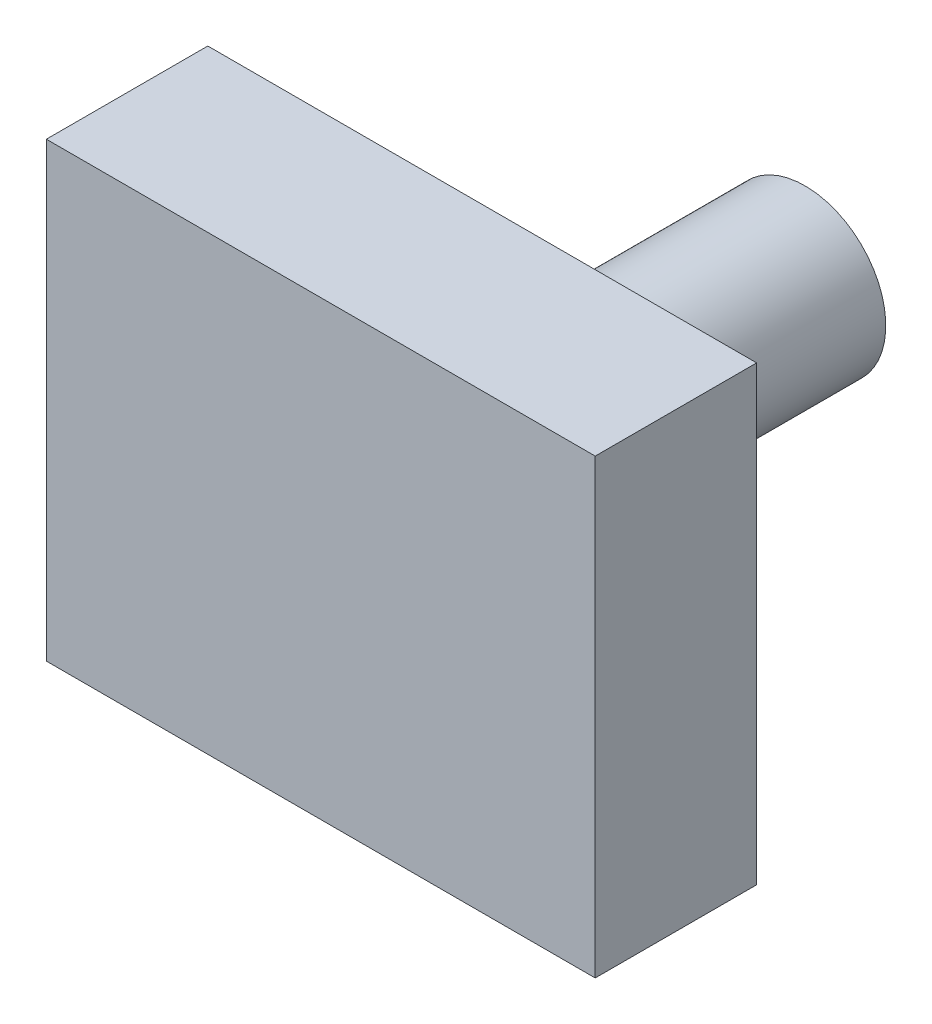
ISO-10303-21;
HEADER;
FILE_DESCRIPTION(('STEP AP214'),'2;1');
FILE_NAME('part.step','',(''),(''),'','','');
FILE_SCHEMA(('AUTOMOTIVE_DESIGN { 1 0 10303 214 1 1 1 1 }'));
ENDSEC;
DATA;
#1=APPLICATION_CONTEXT('core data for automotive mechanical design processes');
#2=APPLICATION_PROTOCOL_DEFINITION('international standard','automotive_design',2000,#1);
#3=PRODUCT_CONTEXT('',#1,'mechanical');
#4=PRODUCT('Part','Part','',(#3));
#5=PRODUCT_RELATED_PRODUCT_CATEGORY('part','',(#4));
#6=PRODUCT_DEFINITION_FORMATION('','',#4);
#7=PRODUCT_DEFINITION_CONTEXT('part definition',#1,'design');
#8=PRODUCT_DEFINITION('design','',#6,#7);
#9=PRODUCT_DEFINITION_SHAPE('','',#8);
#10=(LENGTH_UNIT() NAMED_UNIT(*) SI_UNIT(.MILLI.,.METRE.));
#11=(NAMED_UNIT(*) PLANE_ANGLE_UNIT() SI_UNIT($,.RADIAN.));
#12=(NAMED_UNIT(*) SI_UNIT($,.STERADIAN.) SOLID_ANGLE_UNIT());
#13=UNCERTAINTY_MEASURE_WITH_UNIT(LENGTH_MEASURE(1.E-05),#10,'distance_accuracy_value','');
#14=(GEOMETRIC_REPRESENTATION_CONTEXT(3) GLOBAL_UNCERTAINTY_ASSIGNED_CONTEXT((#13)) GLOBAL_UNIT_ASSIGNED_CONTEXT((#10,
#11,#12)) REPRESENTATION_CONTEXT('',''));
#15=CARTESIAN_POINT('',(0.,0.,0.));
#16=DIRECTION('',(0.,0.,1.));
#17=DIRECTION('',(1.,0.,0.));
#18=AXIS2_PLACEMENT_3D('',#15,#16,#17);
#19=CARTESIAN_POINT('',(8.5,7.,5.));
#20=DIRECTION('',(-1.,0.,0.));
#21=DIRECTION('',(0.,-1.,0.));
#22=AXIS2_PLACEMENT_3D('',#19,#20,#21);
#23=PLANE('',#22);
#24=DIRECTION('',(0.,1.,0.));
#25=VECTOR('',#24,1.);
#26=CARTESIAN_POINT('',(8.5,7.,0.));
#27=LINE('',#26,#25);
#28=CARTESIAN_POINT('',(8.5,-7.,0.));
#29=VERTEX_POINT('',#28);
#30=CARTESIAN_POINT('',(8.5,7.,0.));
#31=VERTEX_POINT('',#30);
#32=EDGE_CURVE('E100',#29,#31,#27,.T.);
#33=ORIENTED_EDGE('',*,*,#32,.T.);
#34=DIRECTION('',(0.,0.,-1.));
#35=VECTOR('',#34,1.);
#36=CARTESIAN_POINT('',(8.5,7.,5.));
#37=LINE('',#36,#35);
#38=CARTESIAN_POINT('',(8.5,7.,5.));
#39=VERTEX_POINT('',#38);
#40=EDGE_CURVE('E37',#39,#31,#37,.T.);
#41=ORIENTED_EDGE('',*,*,#40,.F.);
#42=DIRECTION('',(0.,1.,0.));
#43=VECTOR('',#42,1.);
#44=CARTESIAN_POINT('',(8.5,7.,5.));
#45=LINE('',#44,#43);
#46=CARTESIAN_POINT('',(8.5,-7.,5.));
#47=VERTEX_POINT('',#46);
#48=EDGE_CURVE('E87',#47,#39,#45,.T.);
#49=ORIENTED_EDGE('',*,*,#48,.F.);
#50=DIRECTION('',(0.,0.,-1.));
#51=VECTOR('',#50,1.);
#52=CARTESIAN_POINT('',(8.5,-7.,5.));
#53=LINE('',#52,#51);
#54=EDGE_CURVE('E96',#47,#29,#53,.T.);
#55=ORIENTED_EDGE('',*,*,#54,.T.);
#56=EDGE_LOOP('',(#33,#41,#49,#55));
#57=FACE_BOUND('',#56,.T.);
#58=ADVANCED_FACE('F34',(#57),#23,.F.);
#59=CARTESIAN_POINT('',(-8.5,7.,5.));
#60=DIRECTION('',(0.,-1.,0.));
#61=DIRECTION('',(0.,0.,-1.));
#62=AXIS2_PLACEMENT_3D('',#59,#60,#61);
#63=PLANE('',#62);
#64=DIRECTION('',(-1.,0.,0.));
#65=VECTOR('',#64,1.);
#66=CARTESIAN_POINT('',(-8.5,7.,0.));
#67=LINE('',#66,#65);
#68=CARTESIAN_POINT('',(-8.5,7.,0.));
#69=VERTEX_POINT('',#68);
#70=EDGE_CURVE('E92',#31,#69,#67,.T.);
#71=ORIENTED_EDGE('',*,*,#70,.T.);
#72=DIRECTION('',(0.,0.,-1.));
#73=VECTOR('',#72,1.);
#74=CARTESIAN_POINT('',(-8.5,7.,5.));
#75=LINE('',#74,#73);
#76=CARTESIAN_POINT('',(-8.5,7.,5.));
#77=VERTEX_POINT('',#76);
#78=EDGE_CURVE('E90',#77,#69,#75,.T.);
#79=ORIENTED_EDGE('',*,*,#78,.F.);
#80=DIRECTION('',(-1.,0.,0.));
#81=VECTOR('',#80,1.);
#82=CARTESIAN_POINT('',(-8.5,7.,5.));
#83=LINE('',#82,#81);
#84=EDGE_CURVE('E82',#39,#77,#83,.T.);
#85=ORIENTED_EDGE('',*,*,#84,.F.);
#86=ORIENTED_EDGE('',*,*,#40,.T.);
#87=EDGE_LOOP('',(#71,#79,#85,#86));
#88=FACE_BOUND('',#87,.T.);
#89=ADVANCED_FACE('F91',(#88),#63,.F.);
#90=CARTESIAN_POINT('',(-8.5,7.,5.));
#91=DIRECTION('',(1.,0.,0.));
#92=DIRECTION('',(0.,1.,0.));
#93=AXIS2_PLACEMENT_3D('',#90,#91,#92);
#94=PLANE('',#93);
#95=DIRECTION('',(0.,-1.,0.));
#96=VECTOR('',#95,1.);
#97=CARTESIAN_POINT('',(-8.5,7.,0.));
#98=LINE('',#97,#96);
#99=CARTESIAN_POINT('',(-8.49999999999999,-7.,0.));
#100=VERTEX_POINT('',#99);
#101=EDGE_CURVE('E68',#69,#100,#98,.T.);
#102=ORIENTED_EDGE('',*,*,#101,.T.);
#103=DIRECTION('',(0.,0.,-1.));
#104=VECTOR('',#103,1.);
#105=CARTESIAN_POINT('',(-8.49999999999999,-7.,5.));
#106=LINE('',#105,#104);
#107=CARTESIAN_POINT('',(-8.49999999999999,-7.,5.));
#108=VERTEX_POINT('',#107);
#109=EDGE_CURVE('E93',#108,#100,#106,.T.);
#110=ORIENTED_EDGE('',*,*,#109,.F.);
#111=DIRECTION('',(0.,-1.,0.));
#112=VECTOR('',#111,1.);
#113=CARTESIAN_POINT('',(-8.5,7.,5.));
#114=LINE('',#113,#112);
#115=EDGE_CURVE('E85',#77,#108,#114,.T.);
#116=ORIENTED_EDGE('',*,*,#115,.F.);
#117=ORIENTED_EDGE('',*,*,#78,.T.);
#118=EDGE_LOOP('',(#102,#110,#116,#117));
#119=FACE_BOUND('',#118,.T.);
#120=ADVANCED_FACE('F94',(#119),#94,.F.);
#121=CARTESIAN_POINT('',(-8.49999999999999,-7.,5.));
#122=DIRECTION('',(0.,1.,0.));
#123=DIRECTION('',(0.,0.,1.));
#124=AXIS2_PLACEMENT_3D('',#121,#122,#123);
#125=PLANE('',#124);
#126=DIRECTION('',(1.,0.,0.));
#127=VECTOR('',#126,1.);
#128=CARTESIAN_POINT('',(-8.49999999999999,-7.,0.));
#129=LINE('',#128,#127);
#130=EDGE_CURVE('E74',#100,#29,#129,.T.);
#131=ORIENTED_EDGE('',*,*,#130,.T.);
#132=ORIENTED_EDGE('',*,*,#54,.F.);
#133=DIRECTION('',(1.,0.,0.));
#134=VECTOR('',#133,1.);
#135=CARTESIAN_POINT('',(-8.49999999999999,-7.,5.));
#136=LINE('',#135,#134);
#137=EDGE_CURVE('E51',#108,#47,#136,.T.);
#138=ORIENTED_EDGE('',*,*,#137,.F.);
#139=ORIENTED_EDGE('',*,*,#109,.T.);
#140=EDGE_LOOP('',(#131,#132,#138,#139));
#141=FACE_BOUND('',#140,.T.);
#142=ADVANCED_FACE('F108',(#141),#125,.F.);
#143=CARTESIAN_POINT('',(0.,0.,5.));
#144=DIRECTION('',(0.,0.,1.));
#145=DIRECTION('',(1.,0.,0.));
#146=AXIS2_PLACEMENT_3D('',#143,#144,#145);
#147=PLANE('',#146);
#148=ORIENTED_EDGE('',*,*,#48,.T.);
#149=ORIENTED_EDGE('',*,*,#84,.T.);
#150=ORIENTED_EDGE('',*,*,#115,.T.);
#151=ORIENTED_EDGE('',*,*,#137,.T.);
#152=EDGE_LOOP('',(#148,#149,#150,#151));
#153=FACE_BOUND('',#152,.T.);
#154=ADVANCED_FACE('F83',(#153),#147,.T.);
#155=CARTESIAN_POINT('',(0.,0.,0.));
#156=DIRECTION('',(0.,0.,1.));
#157=DIRECTION('',(1.,0.,0.));
#158=AXIS2_PLACEMENT_3D('',#155,#156,#157);
#159=PLANE('',#158);
#160=CARTESIAN_POINT('',(0.,0.,0.));
#161=DIRECTION('',(0.,0.,-1.));
#162=DIRECTION('',(-1.,0.,0.));
#163=AXIS2_PLACEMENT_3D('',#160,#161,#162);
#164=CIRCLE('',#163,2.5);
#165=CARTESIAN_POINT('',(-2.5,0.,0.));
#166=VERTEX_POINT('',#165);
#167=EDGE_CURVE('E11',#166,#166,#164,.T.);
#168=ORIENTED_EDGE('',*,*,#167,.F.);
#169=EDGE_LOOP('',(#168));
#170=FACE_BOUND('',#169,.T.);
#171=ORIENTED_EDGE('',*,*,#32,.F.);
#172=ORIENTED_EDGE('',*,*,#130,.F.);
#173=ORIENTED_EDGE('',*,*,#101,.F.);
#174=ORIENTED_EDGE('',*,*,#70,.F.);
#175=EDGE_LOOP('',(#171,#172,#173,#174));
#176=FACE_BOUND('',#175,.T.);
#177=ADVANCED_FACE('F111',(#170,#176),#159,.F.);
#178=CARTESIAN_POINT('',(0.,0.,-10.));
#179=DIRECTION('',(0.,0.,1.));
#180=DIRECTION('',(1.,0.,0.));
#181=AXIS2_PLACEMENT_3D('',#178,#179,#180);
#182=CYLINDRICAL_SURFACE('',#181,2.5);
#183=CARTESIAN_POINT('',(0.,0.,-10.));
#184=DIRECTION('',(0.,0.,-1.));
#185=DIRECTION('',(-1.,0.,0.));
#186=AXIS2_PLACEMENT_3D('',#183,#184,#185);
#187=CIRCLE('',#186,2.5);
#188=CARTESIAN_POINT('',(-2.5,0.,-10.));
#189=VERTEX_POINT('',#188);
#190=EDGE_CURVE('E103',#189,#189,#187,.T.);
#191=ORIENTED_EDGE('',*,*,#190,.F.);
#192=EDGE_LOOP('',(#191));
#193=FACE_BOUND('',#192,.T.);
#194=ORIENTED_EDGE('',*,*,#167,.T.);
#195=EDGE_LOOP('',(#194));
#196=FACE_BOUND('',#195,.T.);
#197=ADVANCED_FACE('F119',(#193,#196),#182,.T.);
#198=CARTESIAN_POINT('',(0.,0.,-10.));
#199=DIRECTION('',(0.,0.,-1.));
#200=DIRECTION('',(-1.,0.,0.));
#201=AXIS2_PLACEMENT_3D('',#198,#199,#200);
#202=PLANE('',#201);
#203=ORIENTED_EDGE('',*,*,#190,.T.);
#204=EDGE_LOOP('',(#203));
#205=FACE_BOUND('',#204,.T.);
#206=ADVANCED_FACE('F117',(#205),#202,.T.);
#207=CLOSED_SHELL('',(#58,#89,#120,#142,#154,#177,#197,#206));
#208=MANIFOLD_SOLID_BREP('B2',#207);
#209=ADVANCED_BREP_SHAPE_REPRESENTATION('',(#18,#208),#14);
#210=SHAPE_DEFINITION_REPRESENTATION(#9,#209);
ENDSEC;
END-ISO-10303-21;
